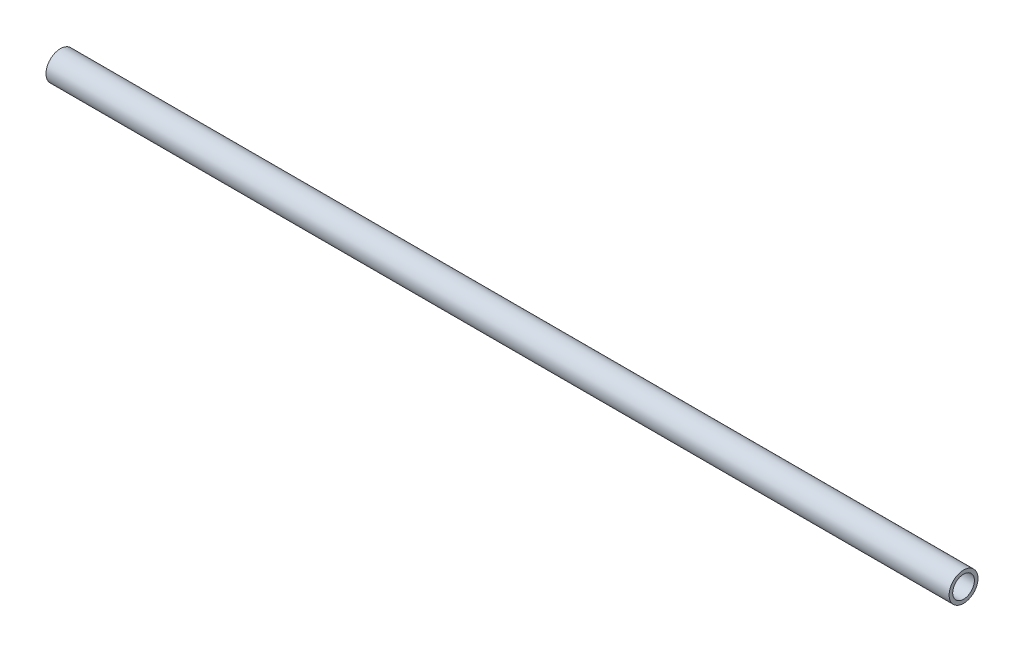
ISO-10303-21;
HEADER;
FILE_DESCRIPTION(('STEP AP214'),'2;1');
FILE_NAME('part.step','',(''),(''),'','','');
FILE_SCHEMA(('AUTOMOTIVE_DESIGN { 1 0 10303 214 1 1 1 1 }'));
ENDSEC;
DATA;
#1=APPLICATION_CONTEXT('core data for automotive mechanical design processes');
#2=APPLICATION_PROTOCOL_DEFINITION('international standard','automotive_design',2000,#1);
#3=PRODUCT_CONTEXT('',#1,'mechanical');
#4=PRODUCT('Part','Part','',(#3));
#5=PRODUCT_RELATED_PRODUCT_CATEGORY('part','',(#4));
#6=PRODUCT_DEFINITION_FORMATION('','',#4);
#7=PRODUCT_DEFINITION_CONTEXT('part definition',#1,'design');
#8=PRODUCT_DEFINITION('design','',#6,#7);
#9=PRODUCT_DEFINITION_SHAPE('','',#8);
#10=(LENGTH_UNIT() NAMED_UNIT(*) SI_UNIT(.MILLI.,.METRE.));
#11=(NAMED_UNIT(*) PLANE_ANGLE_UNIT() SI_UNIT($,.RADIAN.));
#12=(NAMED_UNIT(*) SI_UNIT($,.STERADIAN.) SOLID_ANGLE_UNIT());
#13=UNCERTAINTY_MEASURE_WITH_UNIT(LENGTH_MEASURE(1.E-05),#10,'distance_accuracy_value','');
#14=(GEOMETRIC_REPRESENTATION_CONTEXT(3) GLOBAL_UNCERTAINTY_ASSIGNED_CONTEXT((#13)) GLOBAL_UNIT_ASSIGNED_CONTEXT((#10,
#11,#12)) REPRESENTATION_CONTEXT('',''));
#15=CARTESIAN_POINT('',(0.,0.,0.));
#16=DIRECTION('',(0.,0.,1.));
#17=DIRECTION('',(1.,0.,0.));
#18=AXIS2_PLACEMENT_3D('',#15,#16,#17);
#19=CARTESIAN_POINT('',(250.,0.,0.));
#20=DIRECTION('',(1.,0.,0.));
#21=DIRECTION('',(0.,0.,-1.));
#22=AXIS2_PLACEMENT_3D('',#19,#20,#21);
#23=PLANE('',#22);
#24=CARTESIAN_POINT('',(250.,0.,0.));
#25=DIRECTION('',(1.,0.,0.));
#26=DIRECTION('',(0.,0.,-1.));
#27=AXIS2_PLACEMENT_3D('',#24,#25,#26);
#28=CIRCLE('',#27,4.);
#29=CARTESIAN_POINT('',(250.,0.,-4.));
#30=VERTEX_POINT('',#29);
#31=EDGE_CURVE('E10',#30,#30,#28,.T.);
#32=ORIENTED_EDGE('',*,*,#31,.T.);
#33=EDGE_LOOP('',(#32));
#34=FACE_BOUND('',#33,.T.);
#35=CARTESIAN_POINT('',(250.,0.,0.));
#36=DIRECTION('',(1.,0.,0.));
#37=DIRECTION('',(0.,0.,-1.));
#38=AXIS2_PLACEMENT_3D('',#35,#36,#37);
#39=CIRCLE('',#38,3.);
#40=CARTESIAN_POINT('',(250.,0.,-3.));
#41=VERTEX_POINT('',#40);
#42=EDGE_CURVE('E50',#41,#41,#39,.T.);
#43=ORIENTED_EDGE('',*,*,#42,.F.);
#44=EDGE_LOOP('',(#43));
#45=FACE_BOUND('',#44,.T.);
#46=ADVANCED_FACE('F39',(#34,#45),#23,.T.);
#47=CARTESIAN_POINT('',(0.,0.,0.));
#48=DIRECTION('',(1.,0.,0.));
#49=DIRECTION('',(0.,0.,-1.));
#50=AXIS2_PLACEMENT_3D('',#47,#48,#49);
#51=PLANE('',#50);
#52=CARTESIAN_POINT('',(0.,0.,0.));
#53=DIRECTION('',(1.,0.,0.));
#54=DIRECTION('',(0.,0.,-1.));
#55=AXIS2_PLACEMENT_3D('',#52,#53,#54);
#56=CIRCLE('',#55,4.);
#57=CARTESIAN_POINT('',(0.,0.,-4.));
#58=VERTEX_POINT('',#57);
#59=EDGE_CURVE('E43',#58,#58,#56,.T.);
#60=ORIENTED_EDGE('',*,*,#59,.F.);
#61=EDGE_LOOP('',(#60));
#62=FACE_BOUND('',#61,.T.);
#63=CARTESIAN_POINT('',(0.,0.,0.));
#64=DIRECTION('',(1.,0.,0.));
#65=DIRECTION('',(0.,0.,-1.));
#66=AXIS2_PLACEMENT_3D('',#63,#64,#65);
#67=CIRCLE('',#66,3.);
#68=CARTESIAN_POINT('',(0.,0.,-3.));
#69=VERTEX_POINT('',#68);
#70=EDGE_CURVE('E52',#69,#69,#67,.T.);
#71=ORIENTED_EDGE('',*,*,#70,.T.);
#72=EDGE_LOOP('',(#71));
#73=FACE_BOUND('',#72,.T.);
#74=ADVANCED_FACE('F62',(#62,#73),#51,.F.);
#75=CARTESIAN_POINT('',(250.,0.,0.));
#76=DIRECTION('',(-1.,0.,0.));
#77=DIRECTION('',(0.,0.,1.));
#78=AXIS2_PLACEMENT_3D('',#75,#76,#77);
#79=CYLINDRICAL_SURFACE('',#78,4.);
#80=ORIENTED_EDGE('',*,*,#31,.F.);
#81=EDGE_LOOP('',(#80));
#82=FACE_BOUND('',#81,.T.);
#83=ORIENTED_EDGE('',*,*,#59,.T.);
#84=EDGE_LOOP('',(#83));
#85=FACE_BOUND('',#84,.T.);
#86=ADVANCED_FACE('F41',(#82,#85),#79,.T.);
#87=CARTESIAN_POINT('',(250.,0.,0.));
#88=DIRECTION('',(-1.,0.,0.));
#89=DIRECTION('',(0.,0.,1.));
#90=AXIS2_PLACEMENT_3D('',#87,#88,#89);
#91=CYLINDRICAL_SURFACE('',#90,3.);
#92=ORIENTED_EDGE('',*,*,#42,.T.);
#93=EDGE_LOOP('',(#92));
#94=FACE_BOUND('',#93,.T.);
#95=ORIENTED_EDGE('',*,*,#70,.F.);
#96=EDGE_LOOP('',(#95));
#97=FACE_BOUND('',#96,.T.);
#98=ADVANCED_FACE('F58',(#94,#97),#91,.F.);
#99=CLOSED_SHELL('',(#46,#74,#86,#98));
#100=MANIFOLD_SOLID_BREP('B2',#99);
#101=ADVANCED_BREP_SHAPE_REPRESENTATION('',(#18,#100),#14);
#102=SHAPE_DEFINITION_REPRESENTATION(#9,#101);
ENDSEC;
END-ISO-10303-21;
